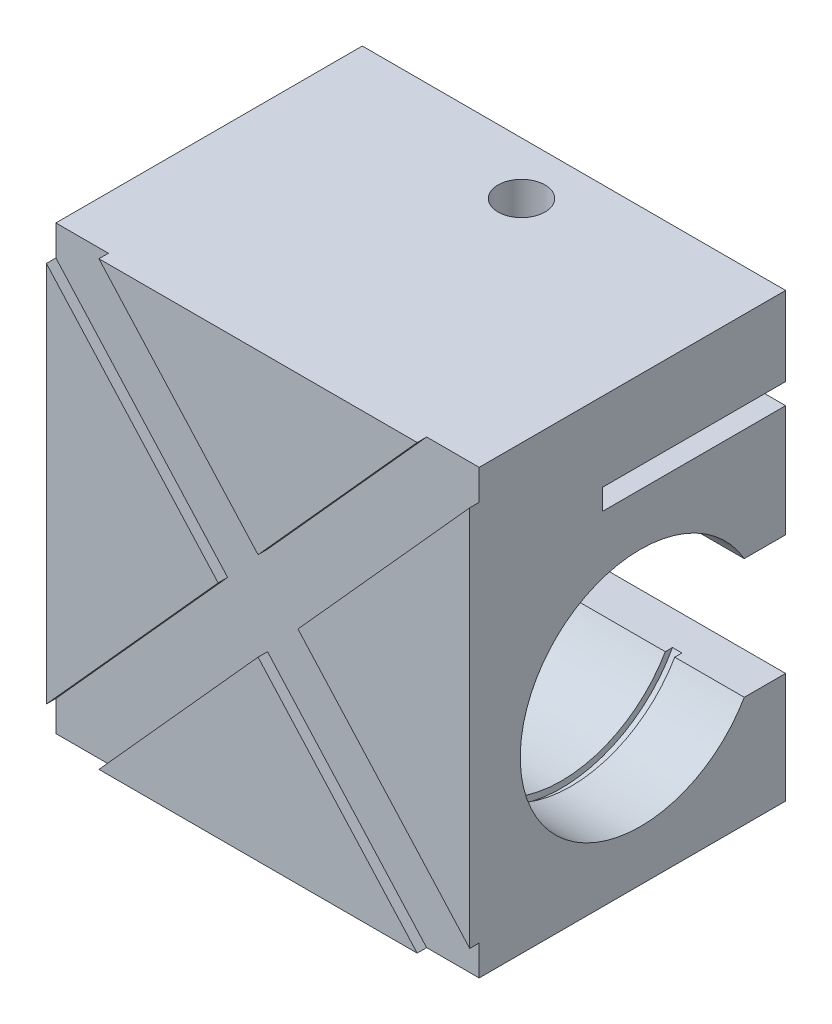
ISO-10303-21;
HEADER;
FILE_DESCRIPTION(('STEP AP214'),'2;1');
FILE_NAME('part.step','',(''),(''),'','','');
FILE_SCHEMA(('AUTOMOTIVE_DESIGN { 1 0 10303 214 1 1 1 1 }'));
ENDSEC;
DATA;
#1=APPLICATION_CONTEXT('core data for automotive mechanical design processes');
#2=APPLICATION_PROTOCOL_DEFINITION('international standard','automotive_design',2000,#1);
#3=PRODUCT_CONTEXT('',#1,'mechanical');
#4=PRODUCT('Part','Part','',(#3));
#5=PRODUCT_RELATED_PRODUCT_CATEGORY('part','',(#4));
#6=PRODUCT_DEFINITION_FORMATION('','',#4);
#7=PRODUCT_DEFINITION_CONTEXT('part definition',#1,'design');
#8=PRODUCT_DEFINITION('design','',#6,#7);
#9=PRODUCT_DEFINITION_SHAPE('','',#8);
#10=(LENGTH_UNIT() NAMED_UNIT(*) SI_UNIT(.MILLI.,.METRE.));
#11=(NAMED_UNIT(*) PLANE_ANGLE_UNIT() SI_UNIT($,.RADIAN.));
#12=(NAMED_UNIT(*) SI_UNIT($,.STERADIAN.) SOLID_ANGLE_UNIT());
#13=UNCERTAINTY_MEASURE_WITH_UNIT(LENGTH_MEASURE(1.E-05),#10,'distance_accuracy_value','');
#14=(GEOMETRIC_REPRESENTATION_CONTEXT(3) GLOBAL_UNCERTAINTY_ASSIGNED_CONTEXT((#13)) GLOBAL_UNIT_ASSIGNED_CONTEXT((#10,
#11,#12)) REPRESENTATION_CONTEXT('',''));
#15=CARTESIAN_POINT('',(0.,0.,0.));
#16=DIRECTION('',(0.,0.,1.));
#17=DIRECTION('',(1.,0.,0.));
#18=AXIS2_PLACEMENT_3D('',#15,#16,#17);
#19=CARTESIAN_POINT('',(0.,-43.,-27.));
#20=DIRECTION('',(1.,0.,0.));
#21=DIRECTION('',(0.,0.,-1.));
#22=AXIS2_PLACEMENT_3D('',#19,#20,#21);
#23=CYLINDRICAL_SURFACE('',#22,19.);
#24=CARTESIAN_POINT('',(11.,-43.,-27.));
#25=DIRECTION('',(1.,0.,0.));
#26=DIRECTION('',(0.,0.,-1.));
#27=AXIS2_PLACEMENT_3D('',#24,#25,#26);
#28=CIRCLE('',#27,19.);
#29=CARTESIAN_POINT('',(11.,-52.5,-43.4544826719043));
#30=VERTEX_POINT('',#29);
#31=CARTESIAN_POINT('',(11.,-33.5,-43.4544826719043));
#32=VERTEX_POINT('',#31);
#33=EDGE_CURVE('E281',#30,#32,#28,.F.);
#34=ORIENTED_EDGE('',*,*,#33,.F.);
#35=DIRECTION('',(1.,0.,0.));
#36=VECTOR('',#35,1.);
#37=CARTESIAN_POINT('',(0.,-52.5,-43.4544826719043));
#38=LINE('',#37,#36);
#39=CARTESIAN_POINT('',(0.,-52.5,-43.4544826719043));
#40=VERTEX_POINT('',#39);
#41=EDGE_CURVE('E385',#40,#30,#38,.T.);
#42=ORIENTED_EDGE('',*,*,#41,.F.);
#43=CARTESIAN_POINT('',(0.,-43.,-27.));
#44=DIRECTION('',(1.,0.,0.));
#45=DIRECTION('',(0.,0.,-1.));
#46=AXIS2_PLACEMENT_3D('',#43,#44,#45);
#47=CIRCLE('',#46,19.);
#48=CARTESIAN_POINT('',(0.,-33.5,-43.4544826719043));
#49=VERTEX_POINT('',#48);
#50=EDGE_CURVE('E365',#49,#40,#47,.T.);
#51=ORIENTED_EDGE('',*,*,#50,.F.);
#52=DIRECTION('',(1.,0.,0.));
#53=VECTOR('',#52,1.);
#54=CARTESIAN_POINT('',(0.,-33.5,-43.4544826719043));
#55=LINE('',#54,#53);
#56=EDGE_CURVE('E380',#49,#32,#55,.T.);
#57=ORIENTED_EDGE('',*,*,#56,.T.);
#58=EDGE_LOOP('',(#34,#42,#51,#57));
#59=FACE_BOUND('',#58,.T.);
#60=ADVANCED_FACE('F45',(#59),#23,.F.);
#61=CARTESIAN_POINT('',(0.,-33.5,-43.4544826719043));
#62=DIRECTION('',(0.,-1.,0.));
#63=DIRECTION('',(0.,0.,-1.));
#64=AXIS2_PLACEMENT_3D('',#61,#62,#63);
#65=PLANE('',#64);
#66=DIRECTION('',(1.,0.,0.));
#67=VECTOR('',#66,1.);
#68=CARTESIAN_POINT('',(11.,-33.5,-44.599715906798));
#69=LINE('',#68,#67);
#70=CARTESIAN_POINT('',(11.,-33.5,-44.599715906798));
#71=VERTEX_POINT('',#70);
#72=CARTESIAN_POINT('',(12.5,-33.5,-44.599715906798));
#73=VERTEX_POINT('',#72);
#74=EDGE_CURVE('E257',#71,#73,#69,.T.);
#75=ORIENTED_EDGE('',*,*,#74,.F.);
#76=DIRECTION('',(0.,0.,1.));
#77=VECTOR('',#76,1.);
#78=CARTESIAN_POINT('',(11.,-33.5,-43.4544826719043));
#79=LINE('',#78,#77);
#80=EDGE_CURVE('E269',#71,#32,#79,.T.);
#81=ORIENTED_EDGE('',*,*,#80,.T.);
#82=ORIENTED_EDGE('',*,*,#56,.F.);
#83=DIRECTION('',(0.,0.,-1.));
#84=VECTOR('',#83,1.);
#85=CARTESIAN_POINT('',(0.,-33.5,-43.4544826719043));
#86=LINE('',#85,#84);
#87=CARTESIAN_POINT('',(0.,-33.5,-50.));
#88=VERTEX_POINT('',#87);
#89=EDGE_CURVE('E358',#49,#88,#86,.T.);
#90=ORIENTED_EDGE('',*,*,#89,.T.);
#91=DIRECTION('',(1.,0.,0.));
#92=VECTOR('',#91,1.);
#93=CARTESIAN_POINT('',(0.,-33.5,-50.));
#94=LINE('',#93,#92);
#95=CARTESIAN_POINT('',(67.,-33.5,-50.));
#96=VERTEX_POINT('',#95);
#97=EDGE_CURVE('E393',#88,#96,#94,.T.);
#98=ORIENTED_EDGE('',*,*,#97,.T.);
#99=DIRECTION('',(0.,0.,-1.));
#100=VECTOR('',#99,1.);
#101=CARTESIAN_POINT('',(67.,-33.5,-43.4544826719043));
#102=LINE('',#101,#100);
#103=CARTESIAN_POINT('',(67.,-33.5,-43.4544826719043));
#104=VERTEX_POINT('',#103);
#105=EDGE_CURVE('E349',#104,#96,#102,.T.);
#106=ORIENTED_EDGE('',*,*,#105,.F.);
#107=CARTESIAN_POINT('',(56.,-33.5,-43.4544826719043));
#108=VERTEX_POINT('',#107);
#109=EDGE_CURVE('E369',#108,#104,#55,.T.);
#110=ORIENTED_EDGE('',*,*,#109,.F.);
#111=DIRECTION('',(0.,0.,1.));
#112=VECTOR('',#111,1.);
#113=CARTESIAN_POINT('',(56.,-33.5,-43.4544826719043));
#114=LINE('',#113,#112);
#115=CARTESIAN_POINT('',(56.,-33.5,-44.599715906798));
#116=VERTEX_POINT('',#115);
#117=EDGE_CURVE('E306',#116,#108,#114,.T.);
#118=ORIENTED_EDGE('',*,*,#117,.F.);
#119=DIRECTION('',(-1.,0.,0.));
#120=VECTOR('',#119,1.);
#121=CARTESIAN_POINT('',(56.,-33.5,-44.599715906798));
#122=LINE('',#121,#120);
#123=CARTESIAN_POINT('',(54.5,-33.5,-44.599715906798));
#124=VERTEX_POINT('',#123);
#125=EDGE_CURVE('E309',#116,#124,#122,.T.);
#126=ORIENTED_EDGE('',*,*,#125,.T.);
#127=DIRECTION('',(0.,0.,1.));
#128=VECTOR('',#127,1.);
#129=CARTESIAN_POINT('',(54.5,-33.5,-43.4544826719043));
#130=LINE('',#129,#128);
#131=CARTESIAN_POINT('',(54.5,-33.5,-43.4544826719043));
#132=VERTEX_POINT('',#131);
#133=EDGE_CURVE('E300',#124,#132,#130,.T.);
#134=ORIENTED_EDGE('',*,*,#133,.T.);
#135=CARTESIAN_POINT('',(12.5,-33.5,-43.4544826719043));
#136=VERTEX_POINT('',#135);
#137=EDGE_CURVE('E279',#136,#132,#55,.T.);
#138=ORIENTED_EDGE('',*,*,#137,.F.);
#139=DIRECTION('',(0.,0.,1.));
#140=VECTOR('',#139,1.);
#141=CARTESIAN_POINT('',(12.5,-33.5,-43.4544826719043));
#142=LINE('',#141,#140);
#143=EDGE_CURVE('E272',#73,#136,#142,.T.);
#144=ORIENTED_EDGE('',*,*,#143,.F.);
#145=EDGE_LOOP('',(#75,#81,#82,#90,#98,#106,#110,#118,#126,#134,#138,#144));
#146=FACE_BOUND('',#145,.T.);
#147=ADVANCED_FACE('F277',(#146),#65,.T.);
#148=CARTESIAN_POINT('',(0.,-52.5,-50.));
#149=DIRECTION('',(0.,1.,0.));
#150=DIRECTION('',(0.,0.,1.));
#151=AXIS2_PLACEMENT_3D('',#148,#149,#150);
#152=PLANE('',#151);
#153=ORIENTED_EDGE('',*,*,#41,.T.);
#154=DIRECTION('',(0.,0.,-1.));
#155=VECTOR('',#154,1.);
#156=CARTESIAN_POINT('',(11.,-52.5,-50.));
#157=LINE('',#156,#155);
#158=CARTESIAN_POINT('',(11.,-52.5,-44.599715906798));
#159=VERTEX_POINT('',#158);
#160=EDGE_CURVE('E11',#30,#159,#157,.T.);
#161=ORIENTED_EDGE('',*,*,#160,.T.);
#162=DIRECTION('',(1.,0.,0.));
#163=VECTOR('',#162,1.);
#164=CARTESIAN_POINT('',(11.,-52.5,-44.599715906798));
#165=LINE('',#164,#163);
#166=CARTESIAN_POINT('',(12.5,-52.5,-44.599715906798));
#167=VERTEX_POINT('',#166);
#168=EDGE_CURVE('E54',#167,#159,#165,.F.);
#169=ORIENTED_EDGE('',*,*,#168,.F.);
#170=DIRECTION('',(0.,0.,-1.));
#171=VECTOR('',#170,1.);
#172=CARTESIAN_POINT('',(12.5,-52.5,-50.));
#173=LINE('',#172,#171);
#174=CARTESIAN_POINT('',(12.5,-52.5,-43.4544826719043));
#175=VERTEX_POINT('',#174);
#176=EDGE_CURVE('E273',#175,#167,#173,.T.);
#177=ORIENTED_EDGE('',*,*,#176,.F.);
#178=CARTESIAN_POINT('',(54.5,-52.5,-43.4544826719043));
#179=VERTEX_POINT('',#178);
#180=EDGE_CURVE('E68',#175,#179,#38,.T.);
#181=ORIENTED_EDGE('',*,*,#180,.T.);
#182=DIRECTION('',(0.,0.,-1.));
#183=VECTOR('',#182,1.);
#184=CARTESIAN_POINT('',(54.5,-52.5,-50.));
#185=LINE('',#184,#183);
#186=CARTESIAN_POINT('',(54.5,-52.5,-44.599715906798));
#187=VERTEX_POINT('',#186);
#188=EDGE_CURVE('E294',#179,#187,#185,.T.);
#189=ORIENTED_EDGE('',*,*,#188,.T.);
#190=DIRECTION('',(-1.,0.,0.));
#191=VECTOR('',#190,1.);
#192=CARTESIAN_POINT('',(56.,-52.5,-44.599715906798));
#193=LINE('',#192,#191);
#194=CARTESIAN_POINT('',(56.,-52.5,-44.599715906798));
#195=VERTEX_POINT('',#194);
#196=EDGE_CURVE('E590',#187,#195,#193,.F.);
#197=ORIENTED_EDGE('',*,*,#196,.T.);
#198=DIRECTION('',(0.,0.,-1.));
#199=VECTOR('',#198,1.);
#200=CARTESIAN_POINT('',(56.,-52.5,-50.));
#201=LINE('',#200,#199);
#202=CARTESIAN_POINT('',(56.,-52.5,-43.4544826719043));
#203=VERTEX_POINT('',#202);
#204=EDGE_CURVE('E303',#203,#195,#201,.T.);
#205=ORIENTED_EDGE('',*,*,#204,.F.);
#206=CARTESIAN_POINT('',(67.,-52.5,-43.4544826719043));
#207=VERTEX_POINT('',#206);
#208=EDGE_CURVE('E384',#203,#207,#38,.T.);
#209=ORIENTED_EDGE('',*,*,#208,.T.);
#210=DIRECTION('',(0.,0.,1.));
#211=VECTOR('',#210,1.);
#212=CARTESIAN_POINT('',(67.,-52.5,-50.));
#213=LINE('',#212,#211);
#214=CARTESIAN_POINT('',(67.,-52.5,-50.));
#215=VERTEX_POINT('',#214);
#216=EDGE_CURVE('E373',#215,#207,#213,.T.);
#217=ORIENTED_EDGE('',*,*,#216,.F.);
#218=DIRECTION('',(1.,0.,0.));
#219=VECTOR('',#218,1.);
#220=CARTESIAN_POINT('',(0.,-52.5,-50.));
#221=LINE('',#220,#219);
#222=CARTESIAN_POINT('',(0.,-52.5,-50.));
#223=VERTEX_POINT('',#222);
#224=EDGE_CURVE('E389',#223,#215,#221,.T.);
#225=ORIENTED_EDGE('',*,*,#224,.F.);
#226=DIRECTION('',(0.,0.,1.));
#227=VECTOR('',#226,1.);
#228=CARTESIAN_POINT('',(0.,-52.5,-50.));
#229=LINE('',#228,#227);
#230=EDGE_CURVE('E361',#223,#40,#229,.T.);
#231=ORIENTED_EDGE('',*,*,#230,.T.);
#232=EDGE_LOOP('',(#153,#161,#169,#177,#181,#189,#197,#205,#209,#217,#225,#231));
#233=FACE_BOUND('',#232,.T.);
#234=ADVANCED_FACE('F601',(#233),#152,.T.);
#235=ORIENTED_EDGE('',*,*,#180,.F.);
#236=CARTESIAN_POINT('',(12.5,-43.,-27.));
#237=DIRECTION('',(1.,0.,0.));
#238=DIRECTION('',(0.,0.,-1.));
#239=AXIS2_PLACEMENT_3D('',#236,#237,#238);
#240=CIRCLE('',#239,19.);
#241=EDGE_CURVE('E61',#175,#136,#240,.F.);
#242=ORIENTED_EDGE('',*,*,#241,.T.);
#243=ORIENTED_EDGE('',*,*,#137,.T.);
#244=CARTESIAN_POINT('',(54.5,-43.,-27.));
#245=DIRECTION('',(1.,0.,0.));
#246=DIRECTION('',(0.,0.,-1.));
#247=AXIS2_PLACEMENT_3D('',#244,#245,#246);
#248=CIRCLE('',#247,19.);
#249=EDGE_CURVE('E581',#179,#132,#248,.F.);
#250=ORIENTED_EDGE('',*,*,#249,.F.);
#251=EDGE_LOOP('',(#235,#242,#243,#250));
#252=FACE_BOUND('',#251,.T.);
#253=ADVANCED_FACE('F681',(#252),#23,.F.);
#254=CARTESIAN_POINT('',(0.,-70.,-50.));
#255=DIRECTION('',(0.,0.,1.));
#256=DIRECTION('',(1.,0.,0.));
#257=AXIS2_PLACEMENT_3D('',#254,#255,#256);
#258=PLANE('',#257);
#259=DIRECTION('',(0.,1.,0.));
#260=VECTOR('',#259,1.);
#261=CARTESIAN_POINT('',(0.,-70.,-50.));
#262=LINE('',#261,#260);
#263=CARTESIAN_POINT('',(0.,-15.8,-50.));
#264=VERTEX_POINT('',#263);
#265=EDGE_CURVE('E568',#88,#264,#262,.T.);
#266=ORIENTED_EDGE('',*,*,#265,.T.);
#267=DIRECTION('',(1.,0.,0.));
#268=VECTOR('',#267,1.);
#269=CARTESIAN_POINT('',(0.,-15.8,-50.));
#270=LINE('',#269,#268);
#271=CARTESIAN_POINT('',(67.,-15.8,-50.));
#272=VERTEX_POINT('',#271);
#273=EDGE_CURVE('E345',#264,#272,#270,.T.);
#274=ORIENTED_EDGE('',*,*,#273,.T.);
#275=DIRECTION('',(0.,1.,0.));
#276=VECTOR('',#275,1.);
#277=CARTESIAN_POINT('',(67.,-70.,-50.));
#278=LINE('',#277,#276);
#279=EDGE_CURVE('E582',#96,#272,#278,.T.);
#280=ORIENTED_EDGE('',*,*,#279,.F.);
#281=ORIENTED_EDGE('',*,*,#97,.F.);
#282=EDGE_LOOP('',(#266,#274,#280,#281));
#283=FACE_BOUND('',#282,.T.);
#284=ADVANCED_FACE('F616',(#283),#258,.F.);
#285=CARTESIAN_POINT('',(67.,-70.,0.));
#286=DIRECTION('',(1.,0.,0.));
#287=DIRECTION('',(0.,0.,-1.));
#288=AXIS2_PLACEMENT_3D('',#285,#286,#287);
#289=PLANE('',#288);
#290=DIRECTION('',(0.,0.,-1.));
#291=VECTOR('',#290,1.);
#292=CARTESIAN_POINT('',(67.,-15.8,-50.));
#293=LINE('',#292,#291);
#294=CARTESIAN_POINT('',(67.,-15.8,-21.));
#295=VERTEX_POINT('',#294);
#296=EDGE_CURVE('E327',#295,#272,#293,.T.);
#297=ORIENTED_EDGE('',*,*,#296,.F.);
#298=DIRECTION('',(0.,-1.,0.));
#299=VECTOR('',#298,1.);
#300=CARTESIAN_POINT('',(67.,-12.5,-21.));
#301=LINE('',#300,#299);
#302=CARTESIAN_POINT('',(67.,-12.5,-21.));
#303=VERTEX_POINT('',#302);
#304=EDGE_CURVE('E339',#303,#295,#301,.T.);
#305=ORIENTED_EDGE('',*,*,#304,.F.);
#306=DIRECTION('',(0.,0.,1.));
#307=VECTOR('',#306,1.);
#308=CARTESIAN_POINT('',(67.,-12.5,-50.));
#309=LINE('',#308,#307);
#310=CARTESIAN_POINT('',(67.,-12.5,-50.));
#311=VERTEX_POINT('',#310);
#312=EDGE_CURVE('E321',#311,#303,#309,.T.);
#313=ORIENTED_EDGE('',*,*,#312,.F.);
#314=CARTESIAN_POINT('',(67.,0.,-50.));
#315=VERTEX_POINT('',#314);
#316=EDGE_CURVE('E576',#311,#315,#278,.T.);
#317=ORIENTED_EDGE('',*,*,#316,.T.);
#318=DIRECTION('',(0.,0.,-1.));
#319=VECTOR('',#318,1.);
#320=CARTESIAN_POINT('',(67.,0.,0.));
#321=LINE('',#320,#319);
#322=CARTESIAN_POINT('',(67.,0.,-1.5));
#323=VERTEX_POINT('',#322);
#324=EDGE_CURVE('E552',#323,#315,#321,.T.);
#325=ORIENTED_EDGE('',*,*,#324,.F.);
#326=DIRECTION('',(0.,1.,0.));
#327=VECTOR('',#326,1.);
#328=CARTESIAN_POINT('',(67.,-70.,-1.5));
#329=LINE('',#328,#327);
#330=CARTESIAN_POINT('',(67.,-4.79999999999998,-1.5));
#331=VERTEX_POINT('',#330);
#332=EDGE_CURVE('E396',#331,#323,#329,.T.);
#333=ORIENTED_EDGE('',*,*,#332,.F.);
#334=DIRECTION('',(0.,0.,-1.));
#335=VECTOR('',#334,1.);
#336=CARTESIAN_POINT('',(67.,-4.8,198.795863840397));
#337=LINE('',#336,#335);
#338=CARTESIAN_POINT('',(67.,-4.80000000000001,0.));
#339=VERTEX_POINT('',#338);
#340=EDGE_CURVE('E519',#339,#331,#337,.T.);
#341=ORIENTED_EDGE('',*,*,#340,.F.);
#342=DIRECTION('',(0.,1.,0.));
#343=VECTOR('',#342,1.);
#344=CARTESIAN_POINT('',(67.,-70.,0.));
#345=LINE('',#344,#343);
#346=CARTESIAN_POINT('',(67.,-65.2,0.));
#347=VERTEX_POINT('',#346);
#348=EDGE_CURVE('E572',#347,#339,#345,.T.);
#349=ORIENTED_EDGE('',*,*,#348,.F.);
#350=DIRECTION('',(0.,0.,-1.));
#351=VECTOR('',#350,1.);
#352=CARTESIAN_POINT('',(67.,-65.2,198.795863840397));
#353=LINE('',#352,#351);
#354=CARTESIAN_POINT('',(67.,-65.2,-1.5));
#355=VERTEX_POINT('',#354);
#356=EDGE_CURVE('E516',#347,#355,#353,.T.);
#357=ORIENTED_EDGE('',*,*,#356,.T.);
#358=DIRECTION('',(0.,1.,0.));
#359=VECTOR('',#358,1.);
#360=CARTESIAN_POINT('',(67.,-65.2,-1.5));
#361=LINE('',#360,#359);
#362=CARTESIAN_POINT('',(67.,-70.,-1.5));
#363=VERTEX_POINT('',#362);
#364=EDGE_CURVE('E472',#363,#355,#361,.T.);
#365=ORIENTED_EDGE('',*,*,#364,.F.);
#366=DIRECTION('',(0.,0.,-1.));
#367=VECTOR('',#366,1.);
#368=CARTESIAN_POINT('',(67.,-70.,0.));
#369=LINE('',#368,#367);
#370=CARTESIAN_POINT('',(67.,-70.,-50.));
#371=VERTEX_POINT('',#370);
#372=EDGE_CURVE('E537',#363,#371,#369,.T.);
#373=ORIENTED_EDGE('',*,*,#372,.T.);
#374=EDGE_CURVE('E577',#371,#215,#278,.T.);
#375=ORIENTED_EDGE('',*,*,#374,.T.);
#376=ORIENTED_EDGE('',*,*,#216,.T.);
#377=CARTESIAN_POINT('',(67.,-43.,-27.));
#378=DIRECTION('',(1.,0.,0.));
#379=DIRECTION('',(0.,0.,-1.));
#380=AXIS2_PLACEMENT_3D('',#377,#378,#379);
#381=CIRCLE('',#380,19.);
#382=EDGE_CURVE('E362',#104,#207,#381,.T.);
#383=ORIENTED_EDGE('',*,*,#382,.F.);
#384=ORIENTED_EDGE('',*,*,#105,.T.);
#385=ORIENTED_EDGE('',*,*,#279,.T.);
#386=EDGE_LOOP('',(#297,#305,#313,#317,#325,#333,#341,#349,#357,#365,#373,#375,#376,#383,#384,#385));
#387=FACE_BOUND('',#386,.T.);
#388=ADVANCED_FACE('F625',(#387),#289,.T.);
#389=CARTESIAN_POINT('',(0.,-70.,0.));
#390=DIRECTION('',(1.,0.,0.));
#391=DIRECTION('',(0.,0.,-1.));
#392=AXIS2_PLACEMENT_3D('',#389,#390,#391);
#393=PLANE('',#392);
#394=DIRECTION('',(0.,-1.,0.));
#395=VECTOR('',#394,1.);
#396=CARTESIAN_POINT('',(0.,-12.5,-21.));
#397=LINE('',#396,#395);
#398=CARTESIAN_POINT('',(0.,-12.5,-21.));
#399=VERTEX_POINT('',#398);
#400=CARTESIAN_POINT('',(0.,-15.8,-21.));
#401=VERTEX_POINT('',#400);
#402=EDGE_CURVE('E326',#399,#401,#397,.T.);
#403=ORIENTED_EDGE('',*,*,#402,.T.);
#404=DIRECTION('',(0.,0.,-1.));
#405=VECTOR('',#404,1.);
#406=CARTESIAN_POINT('',(0.,-15.8,-50.));
#407=LINE('',#406,#405);
#408=EDGE_CURVE('E331',#401,#264,#407,.T.);
#409=ORIENTED_EDGE('',*,*,#408,.T.);
#410=ORIENTED_EDGE('',*,*,#265,.F.);
#411=ORIENTED_EDGE('',*,*,#89,.F.);
#412=ORIENTED_EDGE('',*,*,#50,.T.);
#413=ORIENTED_EDGE('',*,*,#230,.F.);
#414=CARTESIAN_POINT('',(0.,-70.,-50.));
#415=VERTEX_POINT('',#414);
#416=EDGE_CURVE('E563',#415,#223,#262,.T.);
#417=ORIENTED_EDGE('',*,*,#416,.F.);
#418=DIRECTION('',(0.,0.,-1.));
#419=VECTOR('',#418,1.);
#420=CARTESIAN_POINT('',(0.,-70.,0.));
#421=LINE('',#420,#419);
#422=CARTESIAN_POINT('',(0.,-70.,-1.5));
#423=VERTEX_POINT('',#422);
#424=EDGE_CURVE('E545',#423,#415,#421,.T.);
#425=ORIENTED_EDGE('',*,*,#424,.F.);
#426=DIRECTION('',(0.,-1.,0.));
#427=VECTOR('',#426,1.);
#428=CARTESIAN_POINT('',(0.,-65.2,-1.5));
#429=LINE('',#428,#427);
#430=CARTESIAN_POINT('',(0.,-65.2,-1.5));
#431=VERTEX_POINT('',#430);
#432=EDGE_CURVE('E453',#431,#423,#429,.T.);
#433=ORIENTED_EDGE('',*,*,#432,.F.);
#434=DIRECTION('',(0.,0.,-1.));
#435=VECTOR('',#434,1.);
#436=CARTESIAN_POINT('',(0.,-65.2,198.795863840397));
#437=LINE('',#436,#435);
#438=CARTESIAN_POINT('',(0.,-65.2,0.));
#439=VERTEX_POINT('',#438);
#440=EDGE_CURVE('E501',#439,#431,#437,.T.);
#441=ORIENTED_EDGE('',*,*,#440,.F.);
#442=DIRECTION('',(0.,1.,0.));
#443=VECTOR('',#442,1.);
#444=CARTESIAN_POINT('',(0.,-70.,0.));
#445=LINE('',#444,#443);
#446=CARTESIAN_POINT('',(0.,-4.80000000000001,0.));
#447=VERTEX_POINT('',#446);
#448=EDGE_CURVE('E567',#439,#447,#445,.T.);
#449=ORIENTED_EDGE('',*,*,#448,.T.);
#450=DIRECTION('',(0.,0.,-1.));
#451=VECTOR('',#450,1.);
#452=CARTESIAN_POINT('',(0.,-4.8,198.795863840397));
#453=LINE('',#452,#451);
#454=CARTESIAN_POINT('',(0.,-4.8,-1.5));
#455=VERTEX_POINT('',#454);
#456=EDGE_CURVE('E494',#447,#455,#453,.T.);
#457=ORIENTED_EDGE('',*,*,#456,.T.);
#458=DIRECTION('',(0.,-1.,0.));
#459=VECTOR('',#458,1.);
#460=CARTESIAN_POINT('',(0.,0.,-1.5));
#461=LINE('',#460,#459);
#462=CARTESIAN_POINT('',(0.,0.,-1.5));
#463=VERTEX_POINT('',#462);
#464=EDGE_CURVE('E442',#463,#455,#461,.T.);
#465=ORIENTED_EDGE('',*,*,#464,.F.);
#466=DIRECTION('',(0.,0.,-1.));
#467=VECTOR('',#466,1.);
#468=CARTESIAN_POINT('',(0.,0.,0.));
#469=LINE('',#468,#467);
#470=CARTESIAN_POINT('',(0.,0.,-50.));
#471=VERTEX_POINT('',#470);
#472=EDGE_CURVE('E538',#463,#471,#469,.T.);
#473=ORIENTED_EDGE('',*,*,#472,.T.);
#474=CARTESIAN_POINT('',(0.,-12.5,-50.));
#475=VERTEX_POINT('',#474);
#476=EDGE_CURVE('E548',#475,#471,#262,.T.);
#477=ORIENTED_EDGE('',*,*,#476,.F.);
#478=DIRECTION('',(0.,0.,1.));
#479=VECTOR('',#478,1.);
#480=CARTESIAN_POINT('',(0.,-12.5,-50.));
#481=LINE('',#480,#479);
#482=EDGE_CURVE('E322',#475,#399,#481,.T.);
#483=ORIENTED_EDGE('',*,*,#482,.T.);
#484=EDGE_LOOP('',(#403,#409,#410,#411,#412,#413,#417,#425,#433,#441,#449,#457,#465,#473,#477,#483));
#485=FACE_BOUND('',#484,.T.);
#486=ADVANCED_FACE('F608',(#485),#393,.F.);
#487=ORIENTED_EDGE('',*,*,#316,.F.);
#488=DIRECTION('',(1.,0.,0.));
#489=VECTOR('',#488,1.);
#490=CARTESIAN_POINT('',(0.,-12.5,-50.));
#491=LINE('',#490,#489);
#492=EDGE_CURVE('E335',#475,#311,#491,.T.);
#493=ORIENTED_EDGE('',*,*,#492,.F.);
#494=ORIENTED_EDGE('',*,*,#476,.T.);
#495=DIRECTION('',(1.,0.,0.));
#496=VECTOR('',#495,1.);
#497=CARTESIAN_POINT('',(0.,0.,-50.));
#498=LINE('',#497,#496);
#499=EDGE_CURVE('E426',#471,#315,#498,.T.);
#500=ORIENTED_EDGE('',*,*,#499,.T.);
#501=EDGE_LOOP('',(#487,#493,#494,#500));
#502=FACE_BOUND('',#501,.T.);
#503=ADVANCED_FACE('F47',(#502),#258,.F.);
#504=ORIENTED_EDGE('',*,*,#224,.T.);
#505=ORIENTED_EDGE('',*,*,#374,.F.);
#506=DIRECTION('',(1.,0.,0.));
#507=VECTOR('',#506,1.);
#508=CARTESIAN_POINT('',(0.,-70.,-50.));
#509=LINE('',#508,#507);
#510=EDGE_CURVE('E533',#415,#371,#509,.T.);
#511=ORIENTED_EDGE('',*,*,#510,.F.);
#512=ORIENTED_EDGE('',*,*,#416,.T.);
#513=EDGE_LOOP('',(#504,#505,#511,#512));
#514=FACE_BOUND('',#513,.T.);
#515=ADVANCED_FACE('F669',(#514),#258,.F.);
#516=CARTESIAN_POINT('',(0.,-70.,0.));
#517=DIRECTION('',(0.,0.,1.));
#518=DIRECTION('',(1.,0.,0.));
#519=AXIS2_PLACEMENT_3D('',#516,#517,#518);
#520=PLANE('',#519);
#521=DIRECTION('',(0.669003503005515,0.743259250172071,0.));
#522=VECTOR('',#521,1.);
#523=CARTESIAN_POINT('',(39.8171485439445,-35.,0.));
#524=LINE('',#523,#522);
#525=CARTESIAN_POINT('',(39.8171485439445,-35.,0.));
#526=VERTEX_POINT('',#525);
#527=EDGE_CURVE('E402',#526,#339,#524,.T.);
#528=ORIENTED_EDGE('',*,*,#527,.F.);
#529=DIRECTION('',(-0.669003503005515,0.743259250172071,0.));
#530=VECTOR('',#529,1.);
#531=CARTESIAN_POINT('',(39.8171485439445,-35.,0.));
#532=LINE('',#531,#530);
#533=EDGE_CURVE('E397',#347,#526,#532,.T.);
#534=ORIENTED_EDGE('',*,*,#533,.F.);
#535=ORIENTED_EDGE('',*,*,#348,.T.);
#536=EDGE_LOOP('',(#528,#534,#535));
#537=FACE_BOUND('',#536,.T.);
#538=ADVANCED_FACE('F654',(#537),#520,.T.);
#539=DIRECTION('',(0.669003503005515,-0.743259250172071,0.));
#540=VECTOR('',#539,1.);
#541=CARTESIAN_POINT('',(58.6861561236694,-70.,0.));
#542=LINE('',#541,#540);
#543=CARTESIAN_POINT('',(33.5,-42.0183176454296,0.));
#544=VERTEX_POINT('',#543);
#545=CARTESIAN_POINT('',(58.6861561236694,-70.,0.));
#546=VERTEX_POINT('',#545);
#547=EDGE_CURVE('E401',#544,#546,#542,.T.);
#548=ORIENTED_EDGE('',*,*,#547,.F.);
#549=DIRECTION('',(0.669003503005515,0.743259250172071,0.));
#550=VECTOR('',#549,1.);
#551=CARTESIAN_POINT('',(8.31384387633061,-70.,0.));
#552=LINE('',#551,#550);
#553=CARTESIAN_POINT('',(8.31384387633061,-70.,0.));
#554=VERTEX_POINT('',#553);
#555=EDGE_CURVE('E406',#554,#544,#552,.T.);
#556=ORIENTED_EDGE('',*,*,#555,.F.);
#557=DIRECTION('',(1.,0.,0.));
#558=VECTOR('',#557,1.);
#559=CARTESIAN_POINT('',(0.,-70.,0.));
#560=LINE('',#559,#558);
#561=EDGE_CURVE('E541',#554,#546,#560,.T.);
#562=ORIENTED_EDGE('',*,*,#561,.T.);
#563=EDGE_LOOP('',(#548,#556,#562));
#564=FACE_BOUND('',#563,.T.);
#565=ADVANCED_FACE('F946',(#564),#520,.T.);
#566=DIRECTION('',(-0.669003503005515,-0.743259250172071,0.));
#567=VECTOR('',#566,1.);
#568=CARTESIAN_POINT('',(0.,-65.2,0.));
#569=LINE('',#568,#567);
#570=CARTESIAN_POINT('',(27.1828514560555,-35.,0.));
#571=VERTEX_POINT('',#570);
#572=EDGE_CURVE('E410',#571,#439,#569,.T.);
#573=ORIENTED_EDGE('',*,*,#572,.F.);
#574=DIRECTION('',(0.669003503005515,-0.743259250172071,0.));
#575=VECTOR('',#574,1.);
#576=CARTESIAN_POINT('',(27.1828514560555,-35.,0.));
#577=LINE('',#576,#575);
#578=EDGE_CURVE('E414',#447,#571,#577,.T.);
#579=ORIENTED_EDGE('',*,*,#578,.F.);
#580=ORIENTED_EDGE('',*,*,#448,.F.);
#581=EDGE_LOOP('',(#573,#579,#580));
#582=FACE_BOUND('',#581,.T.);
#583=ADVANCED_FACE('F729',(#582),#520,.T.);
#584=CARTESIAN_POINT('',(0.,-70.,0.));
#585=DIRECTION('',(0.,1.,0.));
#586=DIRECTION('',(0.,0.,1.));
#587=AXIS2_PLACEMENT_3D('',#584,#585,#586);
#588=PLANE('',#587);
#589=DIRECTION('',(0.,0.,-1.));
#590=VECTOR('',#589,1.);
#591=CARTESIAN_POINT('',(58.6861561236694,-70.,198.795863840397));
#592=LINE('',#591,#590);
#593=CARTESIAN_POINT('',(58.6861561236694,-70.,-1.5));
#594=VERTEX_POINT('',#593);
#595=EDGE_CURVE('E512',#546,#594,#592,.T.);
#596=ORIENTED_EDGE('',*,*,#595,.F.);
#597=ORIENTED_EDGE('',*,*,#561,.F.);
#598=DIRECTION('',(0.,0.,-1.));
#599=VECTOR('',#598,1.);
#600=CARTESIAN_POINT('',(8.31384387633061,-70.,198.795863840397));
#601=LINE('',#600,#599);
#602=CARTESIAN_POINT('',(8.31384387633061,-70.,-1.5));
#603=VERTEX_POINT('',#602);
#604=EDGE_CURVE('E505',#554,#603,#601,.T.);
#605=ORIENTED_EDGE('',*,*,#604,.T.);
#606=DIRECTION('',(1.,0.,0.));
#607=VECTOR('',#606,1.);
#608=CARTESIAN_POINT('',(0.,-70.,-1.5));
#609=LINE('',#608,#607);
#610=EDGE_CURVE('E457',#423,#603,#609,.T.);
#611=ORIENTED_EDGE('',*,*,#610,.F.);
#612=ORIENTED_EDGE('',*,*,#424,.T.);
#613=ORIENTED_EDGE('',*,*,#510,.T.);
#614=ORIENTED_EDGE('',*,*,#372,.F.);
#615=DIRECTION('',(1.,0.,0.));
#616=VECTOR('',#615,1.);
#617=CARTESIAN_POINT('',(67.,-70.,-1.5));
#618=LINE('',#617,#616);
#619=EDGE_CURVE('E468',#594,#363,#618,.T.);
#620=ORIENTED_EDGE('',*,*,#619,.F.);
#621=EDGE_LOOP('',(#596,#597,#605,#611,#612,#613,#614,#620));
#622=FACE_BOUND('',#621,.T.);
#623=ADVANCED_FACE('F663',(#622),#588,.F.);
#624=CARTESIAN_POINT('',(0.,0.,0.));
#625=DIRECTION('',(0.,1.,0.));
#626=DIRECTION('',(0.,0.,1.));
#627=AXIS2_PLACEMENT_3D('',#624,#625,#626);
#628=PLANE('',#627);
#629=CARTESIAN_POINT('',(33.5,0.,-41.7));
#630=DIRECTION('',(0.,1.,0.));
#631=DIRECTION('',(0.,0.,1.));
#632=AXIS2_PLACEMENT_3D('',#629,#630,#631);
#633=CIRCLE('',#632,3.72022374390568);
#634=CARTESIAN_POINT('',(33.5,0.,-37.9797762560943));
#635=VERTEX_POINT('',#634);
#636=EDGE_CURVE('E317',#635,#635,#633,.T.);
#637=ORIENTED_EDGE('',*,*,#636,.F.);
#638=EDGE_LOOP('',(#637));
#639=FACE_BOUND('',#638,.T.);
#640=DIRECTION('',(0.,0.,-1.));
#641=VECTOR('',#640,1.);
#642=CARTESIAN_POINT('',(8.31384387633061,0.,198.795863840397));
#643=LINE('',#642,#641);
#644=CARTESIAN_POINT('',(8.31384387633061,0.,0.));
#645=VERTEX_POINT('',#644);
#646=CARTESIAN_POINT('',(8.31384387633061,0.,-1.5));
#647=VERTEX_POINT('',#646);
#648=EDGE_CURVE('E490',#645,#647,#643,.T.);
#649=ORIENTED_EDGE('',*,*,#648,.F.);
#650=DIRECTION('',(1.,0.,0.));
#651=VECTOR('',#650,1.);
#652=CARTESIAN_POINT('',(0.,0.,0.));
#653=LINE('',#652,#651);
#654=CARTESIAN_POINT('',(58.6861561236694,0.,0.));
#655=VERTEX_POINT('',#654);
#656=EDGE_CURVE('E556',#645,#655,#653,.T.);
#657=ORIENTED_EDGE('',*,*,#656,.T.);
#658=DIRECTION('',(0.,0.,-1.));
#659=VECTOR('',#658,1.);
#660=CARTESIAN_POINT('',(58.6861561236694,0.,198.795863840397));
#661=LINE('',#660,#659);
#662=CARTESIAN_POINT('',(58.6861561236694,0.,-1.5));
#663=VERTEX_POINT('',#662);
#664=EDGE_CURVE('E483',#655,#663,#661,.T.);
#665=ORIENTED_EDGE('',*,*,#664,.T.);
#666=DIRECTION('',(-1.,0.,0.));
#667=VECTOR('',#666,1.);
#668=CARTESIAN_POINT('',(58.6861561236694,0.,-1.5));
#669=LINE('',#668,#667);
#670=EDGE_CURVE('E427',#323,#663,#669,.T.);
#671=ORIENTED_EDGE('',*,*,#670,.F.);
#672=ORIENTED_EDGE('',*,*,#324,.T.);
#673=ORIENTED_EDGE('',*,*,#499,.F.);
#674=ORIENTED_EDGE('',*,*,#472,.F.);
#675=DIRECTION('',(-1.,0.,0.));
#676=VECTOR('',#675,1.);
#677=CARTESIAN_POINT('',(0.,0.,-1.5));
#678=LINE('',#677,#676);
#679=EDGE_CURVE('E438',#647,#463,#678,.T.);
#680=ORIENTED_EDGE('',*,*,#679,.F.);
#681=EDGE_LOOP('',(#649,#657,#665,#671,#672,#673,#674,#680));
#682=FACE_BOUND('',#681,.T.);
#683=ADVANCED_FACE('F631',(#639,#682),#628,.T.);
#684=DIRECTION('',(-0.669003503005515,0.743259250172071,0.));
#685=VECTOR('',#684,1.);
#686=CARTESIAN_POINT('',(8.31384387633061,0.,0.));
#687=LINE('',#686,#685);
#688=CARTESIAN_POINT('',(33.5,-27.9816823545704,0.));
#689=VERTEX_POINT('',#688);
#690=EDGE_CURVE('E418',#689,#645,#687,.T.);
#691=ORIENTED_EDGE('',*,*,#690,.F.);
#692=DIRECTION('',(-0.669003503005515,-0.743259250172071,0.));
#693=VECTOR('',#692,1.);
#694=CARTESIAN_POINT('',(33.5,-27.9816823545704,0.));
#695=LINE('',#694,#693);
#696=EDGE_CURVE('E422',#655,#689,#695,.T.);
#697=ORIENTED_EDGE('',*,*,#696,.F.);
#698=ORIENTED_EDGE('',*,*,#656,.F.);
#699=EDGE_LOOP('',(#691,#697,#698));
#700=FACE_BOUND('',#699,.T.);
#701=ADVANCED_FACE('F646',(#700),#520,.T.);
#702=CARTESIAN_POINT('',(39.8171485439445,-35.,198.795863840397));
#703=DIRECTION('',(-0.743259250172071,0.669003503005515,0.));
#704=DIRECTION('',(-0.669003503005515,-0.743259250172071,0.));
#705=AXIS2_PLACEMENT_3D('',#702,#703,#704);
#706=PLANE('',#705);
#707=DIRECTION('',(0.,0.,-1.));
#708=VECTOR('',#707,1.);
#709=CARTESIAN_POINT('',(39.8171485439445,-35.,198.795863840397));
#710=LINE('',#709,#708);
#711=CARTESIAN_POINT('',(39.8171485439445,-35.,-1.5));
#712=VERTEX_POINT('',#711);
#713=EDGE_CURVE('E523',#526,#712,#710,.T.);
#714=ORIENTED_EDGE('',*,*,#713,.F.);
#715=ORIENTED_EDGE('',*,*,#527,.T.);
#716=ORIENTED_EDGE('',*,*,#340,.T.);
#717=DIRECTION('',(0.669003503005515,0.743259250172071,0.));
#718=VECTOR('',#717,1.);
#719=CARTESIAN_POINT('',(39.8171485439445,-35.,-1.5));
#720=LINE('',#719,#718);
#721=EDGE_CURVE('E479',#712,#331,#720,.T.);
#722=ORIENTED_EDGE('',*,*,#721,.F.);
#723=EDGE_LOOP('',(#714,#715,#716,#722));
#724=FACE_BOUND('',#723,.T.);
#725=ADVANCED_FACE('F656',(#724),#706,.T.);
#726=CARTESIAN_POINT('',(39.8171485439445,-35.,198.795863840397));
#727=DIRECTION('',(-0.743259250172071,-0.669003503005515,0.));
#728=DIRECTION('',(0.669003503005515,-0.743259250172071,0.));
#729=AXIS2_PLACEMENT_3D('',#726,#727,#728);
#730=PLANE('',#729);
#731=ORIENTED_EDGE('',*,*,#356,.F.);
#732=ORIENTED_EDGE('',*,*,#533,.T.);
#733=ORIENTED_EDGE('',*,*,#713,.T.);
#734=DIRECTION('',(-0.669003503005515,0.743259250172071,0.));
#735=VECTOR('',#734,1.);
#736=CARTESIAN_POINT('',(39.8171485439445,-35.,-1.5));
#737=LINE('',#736,#735);
#738=EDGE_CURVE('E476',#355,#712,#737,.T.);
#739=ORIENTED_EDGE('',*,*,#738,.F.);
#740=EDGE_LOOP('',(#731,#732,#733,#739));
#741=FACE_BOUND('',#740,.T.);
#742=ADVANCED_FACE('F659',(#741),#730,.T.);
#743=CARTESIAN_POINT('',(58.6861561236694,-70.,198.795863840397));
#744=DIRECTION('',(0.743259250172071,0.669003503005515,0.));
#745=DIRECTION('',(-0.669003503005515,0.743259250172071,0.));
#746=AXIS2_PLACEMENT_3D('',#743,#744,#745);
#747=PLANE('',#746);
#748=DIRECTION('',(0.,0.,-1.));
#749=VECTOR('',#748,1.);
#750=CARTESIAN_POINT('',(33.5,-42.0183176454296,198.795863840397));
#751=LINE('',#750,#749);
#752=CARTESIAN_POINT('',(33.5,-42.0183176454296,-1.5));
#753=VERTEX_POINT('',#752);
#754=EDGE_CURVE('E508',#544,#753,#751,.T.);
#755=ORIENTED_EDGE('',*,*,#754,.F.);
#756=ORIENTED_EDGE('',*,*,#547,.T.);
#757=ORIENTED_EDGE('',*,*,#595,.T.);
#758=DIRECTION('',(0.669003503005515,-0.743259250172071,0.));
#759=VECTOR('',#758,1.);
#760=CARTESIAN_POINT('',(58.6861561236694,-70.,-1.5));
#761=LINE('',#760,#759);
#762=EDGE_CURVE('E464',#753,#594,#761,.T.);
#763=ORIENTED_EDGE('',*,*,#762,.F.);
#764=EDGE_LOOP('',(#755,#756,#757,#763));
#765=FACE_BOUND('',#764,.T.);
#766=ADVANCED_FACE('F853',(#765),#747,.T.);
#767=CARTESIAN_POINT('',(8.31384387633061,-70.,198.795863840397));
#768=DIRECTION('',(-0.743259250172071,0.669003503005515,0.));
#769=DIRECTION('',(-0.669003503005515,-0.743259250172071,0.));
#770=AXIS2_PLACEMENT_3D('',#767,#768,#769);
#771=PLANE('',#770);
#772=ORIENTED_EDGE('',*,*,#604,.F.);
#773=ORIENTED_EDGE('',*,*,#555,.T.);
#774=ORIENTED_EDGE('',*,*,#754,.T.);
#775=DIRECTION('',(0.669003503005515,0.743259250172071,0.));
#776=VECTOR('',#775,1.);
#777=CARTESIAN_POINT('',(8.31384387633061,-70.,-1.5));
#778=LINE('',#777,#776);
#779=EDGE_CURVE('E461',#603,#753,#778,.T.);
#780=ORIENTED_EDGE('',*,*,#779,.F.);
#781=EDGE_LOOP('',(#772,#773,#774,#780));
#782=FACE_BOUND('',#781,.T.);
#783=ADVANCED_FACE('F856',(#782),#771,.T.);
#784=CARTESIAN_POINT('',(0.,-65.2,198.795863840397));
#785=DIRECTION('',(0.743259250172071,-0.669003503005515,0.));
#786=DIRECTION('',(0.669003503005515,0.743259250172071,0.));
#787=AXIS2_PLACEMENT_3D('',#784,#785,#786);
#788=PLANE('',#787);
#789=DIRECTION('',(0.,0.,-1.));
#790=VECTOR('',#789,1.);
#791=CARTESIAN_POINT('',(27.1828514560555,-35.,198.795863840397));
#792=LINE('',#791,#790);
#793=CARTESIAN_POINT('',(27.1828514560555,-35.,-1.5));
#794=VERTEX_POINT('',#793);
#795=EDGE_CURVE('E497',#571,#794,#792,.T.);
#796=ORIENTED_EDGE('',*,*,#795,.F.);
#797=ORIENTED_EDGE('',*,*,#572,.T.);
#798=ORIENTED_EDGE('',*,*,#440,.T.);
#799=DIRECTION('',(-0.669003503005515,-0.743259250172071,0.));
#800=VECTOR('',#799,1.);
#801=CARTESIAN_POINT('',(0.,-65.2,-1.5));
#802=LINE('',#801,#800);
#803=EDGE_CURVE('E449',#794,#431,#802,.T.);
#804=ORIENTED_EDGE('',*,*,#803,.F.);
#805=EDGE_LOOP('',(#796,#797,#798,#804));
#806=FACE_BOUND('',#805,.T.);
#807=ADVANCED_FACE('F860',(#806),#788,.T.);
#808=CARTESIAN_POINT('',(27.1828514560555,-35.,198.795863840397));
#809=DIRECTION('',(0.743259250172071,0.669003503005515,0.));
#810=DIRECTION('',(-0.669003503005515,0.743259250172071,0.));
#811=AXIS2_PLACEMENT_3D('',#808,#809,#810);
#812=PLANE('',#811);
#813=ORIENTED_EDGE('',*,*,#456,.F.);
#814=ORIENTED_EDGE('',*,*,#578,.T.);
#815=ORIENTED_EDGE('',*,*,#795,.T.);
#816=DIRECTION('',(0.669003503005515,-0.743259250172071,0.));
#817=VECTOR('',#816,1.);
#818=CARTESIAN_POINT('',(27.1828514560555,-35.,-1.5));
#819=LINE('',#818,#817);
#820=EDGE_CURVE('E446',#455,#794,#819,.T.);
#821=ORIENTED_EDGE('',*,*,#820,.F.);
#822=EDGE_LOOP('',(#813,#814,#815,#821));
#823=FACE_BOUND('',#822,.T.);
#824=ADVANCED_FACE('F864',(#823),#812,.T.);
#825=CARTESIAN_POINT('',(8.31384387633061,0.,198.795863840397));
#826=DIRECTION('',(-0.743259250172071,-0.669003503005515,0.));
#827=DIRECTION('',(0.669003503005515,-0.743259250172071,0.));
#828=AXIS2_PLACEMENT_3D('',#825,#826,#827);
#829=PLANE('',#828);
#830=DIRECTION('',(0.,0.,-1.));
#831=VECTOR('',#830,1.);
#832=CARTESIAN_POINT('',(33.5,-27.9816823545704,198.795863840397));
#833=LINE('',#832,#831);
#834=CARTESIAN_POINT('',(33.5,-27.9816823545704,-1.5));
#835=VERTEX_POINT('',#834);
#836=EDGE_CURVE('E486',#689,#835,#833,.T.);
#837=ORIENTED_EDGE('',*,*,#836,.F.);
#838=ORIENTED_EDGE('',*,*,#690,.T.);
#839=ORIENTED_EDGE('',*,*,#648,.T.);
#840=DIRECTION('',(-0.669003503005515,0.743259250172071,0.));
#841=VECTOR('',#840,1.);
#842=CARTESIAN_POINT('',(8.31384387633061,0.,-1.5));
#843=LINE('',#842,#841);
#844=EDGE_CURVE('E434',#835,#647,#843,.T.);
#845=ORIENTED_EDGE('',*,*,#844,.F.);
#846=EDGE_LOOP('',(#837,#838,#839,#845));
#847=FACE_BOUND('',#846,.T.);
#848=ADVANCED_FACE('F642',(#847),#829,.T.);
#849=CARTESIAN_POINT('',(33.5,-27.9816823545704,198.795863840397));
#850=DIRECTION('',(0.743259250172071,-0.669003503005515,0.));
#851=DIRECTION('',(0.669003503005515,0.743259250172071,0.));
#852=AXIS2_PLACEMENT_3D('',#849,#850,#851);
#853=PLANE('',#852);
#854=ORIENTED_EDGE('',*,*,#664,.F.);
#855=ORIENTED_EDGE('',*,*,#696,.T.);
#856=ORIENTED_EDGE('',*,*,#836,.T.);
#857=DIRECTION('',(-0.669003503005515,-0.743259250172071,0.));
#858=VECTOR('',#857,1.);
#859=CARTESIAN_POINT('',(33.5,-27.9816823545704,-1.5));
#860=LINE('',#859,#858);
#861=EDGE_CURVE('E431',#663,#835,#860,.T.);
#862=ORIENTED_EDGE('',*,*,#861,.F.);
#863=EDGE_LOOP('',(#854,#855,#856,#862));
#864=FACE_BOUND('',#863,.T.);
#865=ADVANCED_FACE('F648',(#864),#853,.T.);
#866=CARTESIAN_POINT('',(0.,-70.,-1.5));
#867=DIRECTION('',(0.,0.,1.));
#868=DIRECTION('',(1.,0.,0.));
#869=AXIS2_PLACEMENT_3D('',#866,#867,#868);
#870=PLANE('',#869);
#871=ORIENTED_EDGE('',*,*,#861,.T.);
#872=ORIENTED_EDGE('',*,*,#844,.T.);
#873=ORIENTED_EDGE('',*,*,#679,.T.);
#874=ORIENTED_EDGE('',*,*,#464,.T.);
#875=ORIENTED_EDGE('',*,*,#820,.T.);
#876=ORIENTED_EDGE('',*,*,#803,.T.);
#877=ORIENTED_EDGE('',*,*,#432,.T.);
#878=ORIENTED_EDGE('',*,*,#610,.T.);
#879=ORIENTED_EDGE('',*,*,#779,.T.);
#880=ORIENTED_EDGE('',*,*,#762,.T.);
#881=ORIENTED_EDGE('',*,*,#619,.T.);
#882=ORIENTED_EDGE('',*,*,#364,.T.);
#883=ORIENTED_EDGE('',*,*,#738,.T.);
#884=ORIENTED_EDGE('',*,*,#721,.T.);
#885=ORIENTED_EDGE('',*,*,#332,.T.);
#886=ORIENTED_EDGE('',*,*,#670,.T.);
#887=EDGE_LOOP('',(#871,#872,#873,#874,#875,#876,#877,#878,#879,#880,#881,#882,#883,#884,#885,#886));
#888=FACE_BOUND('',#887,.T.);
#889=ADVANCED_FACE('F636',(#888),#870,.T.);
#890=ORIENTED_EDGE('',*,*,#208,.F.);
#891=CARTESIAN_POINT('',(56.,-43.,-27.));
#892=DIRECTION('',(1.,0.,0.));
#893=DIRECTION('',(0.,0.,-1.));
#894=AXIS2_PLACEMENT_3D('',#891,#892,#893);
#895=CIRCLE('',#894,19.);
#896=EDGE_CURVE('E586',#203,#108,#895,.F.);
#897=ORIENTED_EDGE('',*,*,#896,.T.);
#898=ORIENTED_EDGE('',*,*,#109,.T.);
#899=ORIENTED_EDGE('',*,*,#382,.T.);
#900=EDGE_LOOP('',(#890,#897,#898,#899));
#901=FACE_BOUND('',#900,.T.);
#902=ADVANCED_FACE('F674',(#901),#23,.F.);
#903=CARTESIAN_POINT('',(0.,-15.8,-50.));
#904=DIRECTION('',(0.,-1.,0.));
#905=DIRECTION('',(0.,0.,-1.));
#906=AXIS2_PLACEMENT_3D('',#903,#904,#905);
#907=PLANE('',#906);
#908=ORIENTED_EDGE('',*,*,#296,.T.);
#909=ORIENTED_EDGE('',*,*,#273,.F.);
#910=ORIENTED_EDGE('',*,*,#408,.F.);
#911=DIRECTION('',(1.,0.,0.));
#912=VECTOR('',#911,1.);
#913=CARTESIAN_POINT('',(0.,-15.8,-21.));
#914=LINE('',#913,#912);
#915=EDGE_CURVE('E350',#401,#295,#914,.T.);
#916=ORIENTED_EDGE('',*,*,#915,.T.);
#917=EDGE_LOOP('',(#908,#909,#910,#916));
#918=FACE_BOUND('',#917,.T.);
#919=ADVANCED_FACE('F710',(#918),#907,.F.);
#920=CARTESIAN_POINT('',(0.,-12.5,-21.));
#921=DIRECTION('',(0.,0.,1.));
#922=DIRECTION('',(0.,-1.,0.));
#923=AXIS2_PLACEMENT_3D('',#920,#921,#922);
#924=PLANE('',#923);
#925=ORIENTED_EDGE('',*,*,#304,.T.);
#926=ORIENTED_EDGE('',*,*,#915,.F.);
#927=ORIENTED_EDGE('',*,*,#402,.F.);
#928=DIRECTION('',(1.,0.,0.));
#929=VECTOR('',#928,1.);
#930=CARTESIAN_POINT('',(0.,-12.5,-21.));
#931=LINE('',#930,#929);
#932=EDGE_CURVE('E353',#399,#303,#931,.T.);
#933=ORIENTED_EDGE('',*,*,#932,.T.);
#934=EDGE_LOOP('',(#925,#926,#927,#933));
#935=FACE_BOUND('',#934,.T.);
#936=ADVANCED_FACE('F715',(#935),#924,.F.);
#937=CARTESIAN_POINT('',(0.,-12.5,-50.));
#938=DIRECTION('',(0.,1.,0.));
#939=DIRECTION('',(0.,0.,1.));
#940=AXIS2_PLACEMENT_3D('',#937,#938,#939);
#941=PLANE('',#940);
#942=CARTESIAN_POINT('',(33.5,-12.5,-41.7));
#943=DIRECTION('',(0.,1.,0.));
#944=DIRECTION('',(0.,0.,1.));
#945=AXIS2_PLACEMENT_3D('',#942,#943,#944);
#946=CIRCLE('',#945,3.72022374390568);
#947=CARTESIAN_POINT('',(33.5,-12.5,-37.9797762560943));
#948=VERTEX_POINT('',#947);
#949=EDGE_CURVE('E313',#948,#948,#946,.F.);
#950=ORIENTED_EDGE('',*,*,#949,.F.);
#951=EDGE_LOOP('',(#950));
#952=FACE_BOUND('',#951,.T.);
#953=ORIENTED_EDGE('',*,*,#312,.T.);
#954=ORIENTED_EDGE('',*,*,#932,.F.);
#955=ORIENTED_EDGE('',*,*,#482,.F.);
#956=ORIENTED_EDGE('',*,*,#492,.T.);
#957=EDGE_LOOP('',(#953,#954,#955,#956));
#958=FACE_BOUND('',#957,.T.);
#959=ADVANCED_FACE('F759',(#952,#958),#941,.F.);
#960=CARTESIAN_POINT('',(33.5,-70.001,-41.7));
#961=DIRECTION('',(0.,1.,0.));
#962=DIRECTION('',(0.,0.,1.));
#963=AXIS2_PLACEMENT_3D('',#960,#961,#962);
#964=CYLINDRICAL_SURFACE('',#963,3.72022374390568);
#965=ORIENTED_EDGE('',*,*,#636,.T.);
#966=EDGE_LOOP('',(#965));
#967=FACE_BOUND('',#966,.T.);
#968=ORIENTED_EDGE('',*,*,#949,.T.);
#969=EDGE_LOOP('',(#968));
#970=FACE_BOUND('',#969,.T.);
#971=ADVANCED_FACE('F697',(#967,#970),#964,.F.);
#972=CARTESIAN_POINT('',(56.,-43.,-27.));
#973=DIRECTION('',(-1.,0.,0.));
#974=DIRECTION('',(0.,0.,1.));
#975=AXIS2_PLACEMENT_3D('',#972,#973,#974);
#976=CYLINDRICAL_SURFACE('',#975,20.);
#977=CARTESIAN_POINT('',(56.,-43.,-27.));
#978=DIRECTION('',(1.,0.,0.));
#979=DIRECTION('',(0.,0.,-1.));
#980=AXIS2_PLACEMENT_3D('',#977,#978,#979);
#981=CIRCLE('',#980,20.);
#982=EDGE_CURVE('E290',#116,#195,#981,.T.);
#983=ORIENTED_EDGE('',*,*,#982,.T.);
#984=ORIENTED_EDGE('',*,*,#196,.F.);
#985=CARTESIAN_POINT('',(54.5,-43.,-27.));
#986=DIRECTION('',(1.,0.,0.));
#987=DIRECTION('',(0.,0.,-1.));
#988=AXIS2_PLACEMENT_3D('',#985,#986,#987);
#989=CIRCLE('',#988,20.);
#990=EDGE_CURVE('E268',#124,#187,#989,.T.);
#991=ORIENTED_EDGE('',*,*,#990,.F.);
#992=ORIENTED_EDGE('',*,*,#125,.F.);
#993=EDGE_LOOP('',(#983,#984,#991,#992));
#994=FACE_BOUND('',#993,.T.);
#995=ADVANCED_FACE('F687',(#994),#976,.F.);
#996=CARTESIAN_POINT('',(56.,-43.,-27.));
#997=DIRECTION('',(1.,0.,0.));
#998=DIRECTION('',(0.,0.,-1.));
#999=AXIS2_PLACEMENT_3D('',#996,#997,#998);
#1000=PLANE('',#999);
#1001=ORIENTED_EDGE('',*,*,#117,.T.);
#1002=ORIENTED_EDGE('',*,*,#896,.F.);
#1003=ORIENTED_EDGE('',*,*,#204,.T.);
#1004=ORIENTED_EDGE('',*,*,#982,.F.);
#1005=EDGE_LOOP('',(#1001,#1002,#1003,#1004));
#1006=FACE_BOUND('',#1005,.T.);
#1007=ADVANCED_FACE('F689',(#1006),#1000,.F.);
#1008=CARTESIAN_POINT('',(54.5,-43.,-27.));
#1009=DIRECTION('',(1.,0.,0.));
#1010=DIRECTION('',(0.,0.,-1.));
#1011=AXIS2_PLACEMENT_3D('',#1008,#1009,#1010);
#1012=PLANE('',#1011);
#1013=ORIENTED_EDGE('',*,*,#990,.T.);
#1014=ORIENTED_EDGE('',*,*,#188,.F.);
#1015=ORIENTED_EDGE('',*,*,#249,.T.);
#1016=ORIENTED_EDGE('',*,*,#133,.F.);
#1017=EDGE_LOOP('',(#1013,#1014,#1015,#1016));
#1018=FACE_BOUND('',#1017,.T.);
#1019=ADVANCED_FACE('F683',(#1018),#1012,.T.);
#1020=CARTESIAN_POINT('',(11.,-43.,-27.));
#1021=DIRECTION('',(1.,0.,0.));
#1022=DIRECTION('',(0.,0.,-1.));
#1023=AXIS2_PLACEMENT_3D('',#1020,#1021,#1022);
#1024=CYLINDRICAL_SURFACE('',#1023,20.);
#1025=ORIENTED_EDGE('',*,*,#74,.T.);
#1026=CARTESIAN_POINT('',(12.5,-43.,-27.));
#1027=DIRECTION('',(1.,0.,0.));
#1028=DIRECTION('',(0.,0.,-1.));
#1029=AXIS2_PLACEMENT_3D('',#1026,#1027,#1028);
#1030=CIRCLE('',#1029,20.);
#1031=EDGE_CURVE('E260',#73,#167,#1030,.T.);
#1032=ORIENTED_EDGE('',*,*,#1031,.T.);
#1033=ORIENTED_EDGE('',*,*,#168,.T.);
#1034=CARTESIAN_POINT('',(11.,-43.,-27.));
#1035=DIRECTION('',(1.,0.,0.));
#1036=DIRECTION('',(0.,0.,-1.));
#1037=AXIS2_PLACEMENT_3D('',#1034,#1035,#1036);
#1038=CIRCLE('',#1037,20.);
#1039=EDGE_CURVE('E263',#71,#159,#1038,.T.);
#1040=ORIENTED_EDGE('',*,*,#1039,.F.);
#1041=EDGE_LOOP('',(#1025,#1032,#1033,#1040));
#1042=FACE_BOUND('',#1041,.T.);
#1043=ADVANCED_FACE('F259',(#1042),#1024,.F.);
#1044=CARTESIAN_POINT('',(11.,-43.,-27.));
#1045=DIRECTION('',(1.,0.,0.));
#1046=DIRECTION('',(0.,0.,-1.));
#1047=AXIS2_PLACEMENT_3D('',#1044,#1045,#1046);
#1048=PLANE('',#1047);
#1049=ORIENTED_EDGE('',*,*,#1039,.T.);
#1050=ORIENTED_EDGE('',*,*,#160,.F.);
#1051=ORIENTED_EDGE('',*,*,#33,.T.);
#1052=ORIENTED_EDGE('',*,*,#80,.F.);
#1053=EDGE_LOOP('',(#1049,#1050,#1051,#1052));
#1054=FACE_BOUND('',#1053,.T.);
#1055=ADVANCED_FACE('F597',(#1054),#1048,.T.);
#1056=CARTESIAN_POINT('',(12.5,-43.,-27.));
#1057=DIRECTION('',(1.,0.,0.));
#1058=DIRECTION('',(0.,0.,-1.));
#1059=AXIS2_PLACEMENT_3D('',#1056,#1057,#1058);
#1060=PLANE('',#1059);
#1061=ORIENTED_EDGE('',*,*,#143,.T.);
#1062=ORIENTED_EDGE('',*,*,#241,.F.);
#1063=ORIENTED_EDGE('',*,*,#176,.T.);
#1064=ORIENTED_EDGE('',*,*,#1031,.F.);
#1065=EDGE_LOOP('',(#1061,#1062,#1063,#1064));
#1066=FACE_BOUND('',#1065,.T.);
#1067=ADVANCED_FACE('F271',(#1066),#1060,.F.);
#1068=CLOSED_SHELL('',(#60,#147,#234,#253,#284,#388,#486,#503,#515,#538,#565,#583,#623,#683,
#701,#725,#742,#766,#783,#807,#824,#848,#865,#889,#902,#919,#936,#959,#971,#995,#1007,#1019,
#1043,#1055,#1067));
#1069=MANIFOLD_SOLID_BREP('B2',#1068);
#1070=ADVANCED_BREP_SHAPE_REPRESENTATION('',(#18,#1069),#14);
#1071=SHAPE_DEFINITION_REPRESENTATION(#9,#1070);
ENDSEC;
END-ISO-10303-21;
